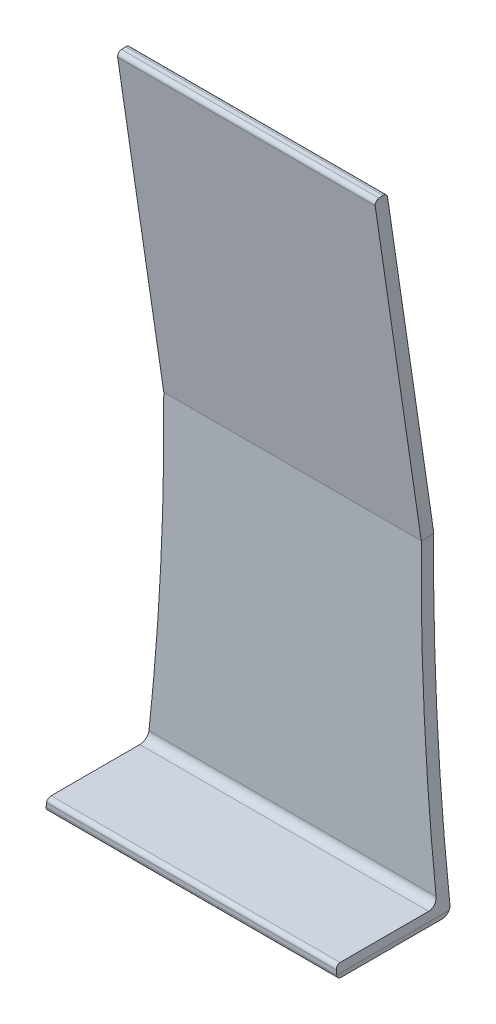
ISO-10303-21;
HEADER;
FILE_DESCRIPTION(('STEP AP214'),'2;1');
FILE_NAME('part.step','',(''),(''),'','','');
FILE_SCHEMA(('AUTOMOTIVE_DESIGN { 1 0 10303 214 1 1 1 1 }'));
ENDSEC;
DATA;
#1=APPLICATION_CONTEXT('core data for automotive mechanical design processes');
#2=APPLICATION_PROTOCOL_DEFINITION('international standard','automotive_design',2000,#1);
#3=PRODUCT_CONTEXT('',#1,'mechanical');
#4=PRODUCT('Part','Part','',(#3));
#5=PRODUCT_RELATED_PRODUCT_CATEGORY('part','',(#4));
#6=PRODUCT_DEFINITION_FORMATION('','',#4);
#7=PRODUCT_DEFINITION_CONTEXT('part definition',#1,'design');
#8=PRODUCT_DEFINITION('design','',#6,#7);
#9=PRODUCT_DEFINITION_SHAPE('','',#8);
#10=(LENGTH_UNIT() NAMED_UNIT(*) SI_UNIT(.MILLI.,.METRE.));
#11=(NAMED_UNIT(*) PLANE_ANGLE_UNIT() SI_UNIT($,.RADIAN.));
#12=(NAMED_UNIT(*) SI_UNIT($,.STERADIAN.) SOLID_ANGLE_UNIT());
#13=UNCERTAINTY_MEASURE_WITH_UNIT(LENGTH_MEASURE(1.E-05),#10,'distance_accuracy_value','');
#14=(GEOMETRIC_REPRESENTATION_CONTEXT(3) GLOBAL_UNCERTAINTY_ASSIGNED_CONTEXT((#13)) GLOBAL_UNIT_ASSIGNED_CONTEXT((#10,
#11,#12)) REPRESENTATION_CONTEXT('',''));
#15=CARTESIAN_POINT('',(0.,0.,0.));
#16=DIRECTION('',(0.,0.,1.));
#17=DIRECTION('',(1.,0.,0.));
#18=AXIS2_PLACEMENT_3D('',#15,#16,#17);
#19=CARTESIAN_POINT('',(70.,1.,-1.));
#20=DIRECTION('',(-1.,0.,0.));
#21=DIRECTION('',(0.,0.,1.));
#22=AXIS2_PLACEMENT_3D('',#19,#20,#21);
#23=CYLINDRICAL_SURFACE('',#22,1.);
#24=CARTESIAN_POINT('',(0.,1.,-1.));
#25=DIRECTION('',(1.,0.,0.));
#26=DIRECTION('',(0.,0.,1.));
#27=AXIS2_PLACEMENT_3D('',#24,#25,#26);
#28=CIRCLE('',#27,1.);
#29=CARTESIAN_POINT('',(0.,1.00000000000001,0.));
#30=VERTEX_POINT('',#29);
#31=CARTESIAN_POINT('',(0.,0.,-1.00000000000001));
#32=VERTEX_POINT('',#31);
#33=EDGE_CURVE('E175',#30,#32,#28,.T.);
#34=ORIENTED_EDGE('',*,*,#33,.T.);
#35=DIRECTION('',(-1.,0.,0.));
#36=VECTOR('',#35,1.);
#37=CARTESIAN_POINT('',(70.,0.,-1.00000000000001));
#38=LINE('',#37,#36);
#39=CARTESIAN_POINT('',(70.,0.,-1.00000000000001));
#40=VERTEX_POINT('',#39);
#41=EDGE_CURVE('E158',#40,#32,#38,.T.);
#42=ORIENTED_EDGE('',*,*,#41,.F.);
#43=CARTESIAN_POINT('',(70.,1.,-1.));
#44=DIRECTION('',(1.,0.,0.));
#45=DIRECTION('',(0.,0.,1.));
#46=AXIS2_PLACEMENT_3D('',#43,#44,#45);
#47=CIRCLE('',#46,1.);
#48=CARTESIAN_POINT('',(70.,1.00000000000001,0.));
#49=VERTEX_POINT('',#48);
#50=EDGE_CURVE('E176',#49,#40,#47,.T.);
#51=ORIENTED_EDGE('',*,*,#50,.F.);
#52=DIRECTION('',(-1.,0.,0.));
#53=VECTOR('',#52,1.);
#54=CARTESIAN_POINT('',(70.,1.00000000000001,0.));
#55=LINE('',#54,#53);
#56=EDGE_CURVE('E165',#49,#30,#55,.T.);
#57=ORIENTED_EDGE('',*,*,#56,.T.);
#58=EDGE_LOOP('',(#34,#42,#51,#57));
#59=FACE_BOUND('',#58,.T.);
#60=ADVANCED_FACE('F32',(#59),#23,.T.);
#61=CARTESIAN_POINT('',(70.,0.,-1.00000000000001));
#62=DIRECTION('',(0.,1.,0.));
#63=DIRECTION('',(0.,0.,1.));
#64=AXIS2_PLACEMENT_3D('',#61,#62,#63);
#65=PLANE('',#64);
#66=DIRECTION('',(0.,0.,-1.));
#67=VECTOR('',#66,1.);
#68=CARTESIAN_POINT('',(0.,0.,-1.00000000000001));
#69=LINE('',#68,#67);
#70=CARTESIAN_POINT('',(0.,0.,-25.3341841889218));
#71=VERTEX_POINT('',#70);
#72=EDGE_CURVE('E70',#32,#71,#69,.T.);
#73=ORIENTED_EDGE('',*,*,#72,.T.);
#74=DIRECTION('',(-1.,0.,0.));
#75=VECTOR('',#74,1.);
#76=CARTESIAN_POINT('',(70.,0.,-25.3341841889218));
#77=LINE('',#76,#75);
#78=CARTESIAN_POINT('',(70.,0.,-25.3341841889218));
#79=VERTEX_POINT('',#78);
#80=EDGE_CURVE('E222',#79,#71,#77,.T.);
#81=ORIENTED_EDGE('',*,*,#80,.F.);
#82=DIRECTION('',(0.,0.,-1.));
#83=VECTOR('',#82,1.);
#84=CARTESIAN_POINT('',(70.,0.,-1.00000000000001));
#85=LINE('',#84,#83);
#86=EDGE_CURVE('E73',#40,#79,#85,.T.);
#87=ORIENTED_EDGE('',*,*,#86,.F.);
#88=ORIENTED_EDGE('',*,*,#41,.T.);
#89=EDGE_LOOP('',(#73,#81,#87,#88));
#90=FACE_BOUND('',#89,.T.);
#91=ADVANCED_FACE('F408',(#90),#65,.F.);
#92=CARTESIAN_POINT('',(70.,2.,-25.3341841889218));
#93=DIRECTION('',(-1.,0.,0.));
#94=DIRECTION('',(0.,0.,1.));
#95=AXIS2_PLACEMENT_3D('',#92,#93,#94);
#96=CYLINDRICAL_SURFACE('',#95,2.);
#97=CARTESIAN_POINT('',(0.,2.,-25.3341841889218));
#98=DIRECTION('',(1.,0.,0.));
#99=DIRECTION('',(0.,0.,-1.));
#100=AXIS2_PLACEMENT_3D('',#97,#98,#99);
#101=CIRCLE('',#100,2.);
#102=CARTESIAN_POINT('',(0.,1.00000000000001,-27.0662349964907));
#103=VERTEX_POINT('',#102);
#104=EDGE_CURVE('E182',#71,#103,#101,.T.);
#105=ORIENTED_EDGE('',*,*,#104,.T.);
#106=CARTESIAN_POINT('',(0.,1.00000000000001,-27.0662349964907));
#107=CARTESIAN_POINT('',(0.00566837473459969,1.04952761063221,-27.094836947414));
#108=CARTESIAN_POINT('',(0.0114703006642798,1.10027558871766,-27.1212966130145));
#109=CARTESIAN_POINT('',(0.0232975177489211,1.20384214234055,-27.1697756343866));
#110=CARTESIAN_POINT('',(0.0293228692363169,1.25666127738482,-27.1917937803082));
#111=CARTESIAN_POINT('',(0.0414193265873751,1.36282520702131,-27.2307967349187));
#112=CARTESIAN_POINT('',(0.0474866984353297,1.41613460472333,-27.247879112971));
#113=CARTESIAN_POINT('',(0.0597444395328533,1.52396073862463,-27.2775091143252));
#114=CARTESIAN_POINT('',(0.0659347580603645,1.57847697795917,-27.2900585683226));
#115=CARTESIAN_POINT('',(0.0789765492342581,1.69346986071201,-27.3114974608418));
#116=CARTESIAN_POINT('',(0.0858360088400424,1.75402964913532,-27.3199384634157));
#117=CARTESIAN_POINT('',(0.0996770976981532,1.87638883643062,-27.33131960102));
#118=CARTESIAN_POINT('',(0.106659207942467,1.93819440360005,-27.3341928791318));
#119=CARTESIAN_POINT('',(0.113631751331707,2.,-27.3341841889218));
#120=B_SPLINE_CURVE_WITH_KNOTS('',3,(#106,#107,#108,#109,#110,#111,#112,#113,#114,#115,#116,
#117,#118,#119),.UNSPECIFIED.,.F.,.F.,(4,2,2,2,2,2,4),(0.,0.172366108157323,0.344779104860919,
0.51350501819713,0.682162712421396,0.866491903333709,1.0530211178474),.UNSPECIFIED.);
#121=CARTESIAN_POINT('',(0.113631751331587,1.99999999999894,-27.3341841889218));
#122=VERTEX_POINT('',#121);
#123=EDGE_CURVE('E46',#103,#122,#120,.T.);
#124=ORIENTED_EDGE('',*,*,#123,.T.);
#125=DIRECTION('',(-1.,0.,0.));
#126=VECTOR('',#125,1.);
#127=CARTESIAN_POINT('',(70.,2.,-27.3341841889218));
#128=LINE('',#127,#126);
#129=CARTESIAN_POINT('',(69.8863682486684,1.99999999999894,-27.3341841889218));
#130=VERTEX_POINT('',#129);
#131=EDGE_CURVE('E219',#130,#122,#128,.T.);
#132=ORIENTED_EDGE('',*,*,#131,.F.);
#133=CARTESIAN_POINT('',(69.8863682486683,2.,-27.3341841889218));
#134=CARTESIAN_POINT('',(69.8928112111658,1.94288887818373,-27.334190307768));
#135=CARTESIAN_POINT('',(69.8992621729982,1.88577903367717,-27.3317381658439));
#136=CARTESIAN_POINT('',(69.9121349316526,1.77195702566754,-27.3219602348797));
#137=CARTESIAN_POINT('',(69.9185567190648,1.71524498765147,-27.3146329722074));
#138=CARTESIAN_POINT('',(69.9311853584759,1.60385410633393,-27.2953563138686));
#139=CARTESIAN_POINT('',(69.9373938685675,1.5491577284811,-27.283509237101));
#140=CARTESIAN_POINT('',(69.9496894095101,1.44096025713908,-27.2552775053766));
#141=CARTESIAN_POINT('',(69.9557764895245,1.38745867881997,-27.2388947284648));
#142=CARTESIAN_POINT('',(69.9683466329068,1.27709892345756,-27.19996699828));
#143=CARTESIAN_POINT('',(69.9748139685758,1.22039048477345,-27.1769910514257));
#144=CARTESIAN_POINT('',(69.9875750933162,1.10862553826579,-27.1256328630637));
#145=CARTESIAN_POINT('',(69.9938658865407,1.05359685458001,-27.0971893208492));
#146=CARTESIAN_POINT('',(70.,1.00000000000001,-27.0662349964907));
#147=B_SPLINE_CURVE_WITH_KNOTS('',3,(#133,#134,#135,#136,#137,#138,#139,#140,#141,#142,#143,
#144,#145,#146),.UNSPECIFIED.,.F.,.F.,(4,2,2,2,2,2,4),(0.,0.172367690504828,0.344787507316629,
0.513515805321455,0.682174344160029,0.866496798530287,1.05302101478268),.UNSPECIFIED.);
#148=CARTESIAN_POINT('',(70.,1.00000000000001,-27.0662349964907));
#149=VERTEX_POINT('',#148);
#150=EDGE_CURVE('E264',#130,#149,#147,.T.);
#151=ORIENTED_EDGE('',*,*,#150,.T.);
#152=CARTESIAN_POINT('',(70.,2.,-25.3341841889218));
#153=DIRECTION('',(1.,0.,0.));
#154=DIRECTION('',(0.,0.,-1.));
#155=AXIS2_PLACEMENT_3D('',#152,#153,#154);
#156=CIRCLE('',#155,2.);
#157=EDGE_CURVE('E177',#79,#149,#156,.T.);
#158=ORIENTED_EDGE('',*,*,#157,.F.);
#159=ORIENTED_EDGE('',*,*,#80,.T.);
#160=EDGE_LOOP('',(#105,#124,#132,#151,#158,#159));
#161=FACE_BOUND('',#160,.T.);
#162=ADVANCED_FACE('F262',(#161),#96,.T.);
#163=CARTESIAN_POINT('',(70.,2.00000000000001,-27.3341841889218));
#164=DIRECTION('',(0.,0.,1.));
#165=DIRECTION('',(1.,0.,0.));
#166=AXIS2_PLACEMENT_3D('',#163,#164,#165);
#167=PLANE('',#166);
#168=ORIENTED_EDGE('',*,*,#131,.T.);
#169=CARTESIAN_POINT('',(0.,1.00000000000001,-27.3341841889218));
#170=CARTESIAN_POINT('',(4.36111830437642,39.1058037315147,-27.3341841889218));
#171=CARTESIAN_POINT('',(4.00000000000001,77.3575311069458,-27.3341841889218));
#172=B_SPLINE_CURVE_WITH_KNOTS('',2,(#169,#170,#171),.UNSPECIFIED.,.F.,.F.,(3,3),(0.,1.),.UNSPECIFIED.);
#173=CARTESIAN_POINT('',(4.00000000000002,77.3575311069458,-27.3341841889218));
#174=VERTEX_POINT('',#173);
#175=EDGE_CURVE('E375',#122,#174,#172,.T.);
#176=ORIENTED_EDGE('',*,*,#175,.T.);
#177=DIRECTION('',(0.,1.,0.));
#178=VECTOR('',#177,1.);
#179=CARTESIAN_POINT('',(4.00000000000003,2.,-27.3341841889218));
#180=LINE('',#179,#178);
#181=CARTESIAN_POINT('',(4.00000000000002,77.577100538008,-27.3341841889218));
#182=VERTEX_POINT('',#181);
#183=EDGE_CURVE('E180',#174,#182,#180,.T.);
#184=ORIENTED_EDGE('',*,*,#183,.T.);
#185=DIRECTION('',(-1.,0.,0.));
#186=VECTOR('',#185,1.);
#187=CARTESIAN_POINT('',(70.,77.577100538008,-27.3341841889218));
#188=LINE('',#187,#186);
#189=CARTESIAN_POINT('',(66.,77.577100538008,-27.3341841889218));
#190=VERTEX_POINT('',#189);
#191=EDGE_CURVE('E216',#190,#182,#188,.T.);
#192=ORIENTED_EDGE('',*,*,#191,.F.);
#193=DIRECTION('',(0.,-1.,0.));
#194=VECTOR('',#193,1.);
#195=CARTESIAN_POINT('',(66.,2.00000000000002,-27.3341841889218));
#196=LINE('',#195,#194);
#197=CARTESIAN_POINT('',(66.,77.3575311069458,-27.3341841889218));
#198=VERTEX_POINT('',#197);
#199=EDGE_CURVE('E243',#190,#198,#196,.T.);
#200=ORIENTED_EDGE('',*,*,#199,.T.);
#201=CARTESIAN_POINT('',(66.,77.3575311069458,-27.3341841889218));
#202=CARTESIAN_POINT('',(65.6388816956236,39.1058037315147,-27.3341841889218));
#203=CARTESIAN_POINT('',(70.,1.00000000000001,-27.3341841889218));
#204=B_SPLINE_CURVE_WITH_KNOTS('',2,(#201,#202,#203),.UNSPECIFIED.,.F.,.F.,(3,3),(0.,1.),.UNSPECIFIED.);
#205=EDGE_CURVE('E266',#198,#130,#204,.T.);
#206=ORIENTED_EDGE('',*,*,#205,.T.);
#207=EDGE_LOOP('',(#168,#176,#184,#192,#200,#206));
#208=FACE_BOUND('',#207,.T.);
#209=ADVANCED_FACE('F386',(#208),#167,.F.);
#210=CARTESIAN_POINT('',(70.,77.577100538008,-27.3341841889218));
#211=DIRECTION('',(0.,-0.145599679864729,0.98934358704309));
#212=DIRECTION('',(0.,-0.98934358704309,-0.145599679864729));
#213=AXIS2_PLACEMENT_3D('',#210,#211,#212);
#214=PLANE('',#213);
#215=ORIENTED_EDGE('',*,*,#191,.T.);
#216=DIRECTION('',(0.,0.98934358704309,0.145599679864729));
#217=VECTOR('',#216,1.);
#218=CARTESIAN_POINT('',(4.00000000000002,77.5771005380079,-27.3341841889218));
#219=LINE('',#218,#217);
#220=CARTESIAN_POINT('',(4.,153.114908846969,-16.2174388524111));
#221=VERTEX_POINT('',#220);
#222=EDGE_CURVE('E185',#182,#221,#219,.T.);
#223=ORIENTED_EDGE('',*,*,#222,.T.);
#224=DIRECTION('',(-1.,0.,0.));
#225=VECTOR('',#224,1.);
#226=CARTESIAN_POINT('',(70.,153.114908846969,-16.2174388524112));
#227=LINE('',#226,#225);
#228=CARTESIAN_POINT('',(66.,153.114908846969,-16.2174388524111));
#229=VERTEX_POINT('',#228);
#230=EDGE_CURVE('E213',#229,#221,#227,.T.);
#231=ORIENTED_EDGE('',*,*,#230,.F.);
#232=DIRECTION('',(0.,-0.98934358704309,-0.145599679864729));
#233=VECTOR('',#232,1.);
#234=CARTESIAN_POINT('',(66.,77.577100538008,-27.3341841889218));
#235=LINE('',#234,#233);
#236=EDGE_CURVE('E248',#229,#190,#235,.T.);
#237=ORIENTED_EDGE('',*,*,#236,.T.);
#238=EDGE_LOOP('',(#215,#223,#231,#237));
#239=FACE_BOUND('',#238,.T.);
#240=ADVANCED_FACE('F393',(#239),#214,.F.);
#241=CARTESIAN_POINT('',(70.,152.969309167104,-15.2280952653679));
#242=DIRECTION('',(-1.,0.,0.));
#243=DIRECTION('',(0.,0.,1.));
#244=AXIS2_PLACEMENT_3D('',#241,#242,#243);
#245=CYLINDRICAL_SURFACE('',#244,1.00000000000008);
#246=ORIENTED_EDGE('',*,*,#230,.T.);
#247=CARTESIAN_POINT('',(4.,152.969309167104,-15.2280952653679));
#248=DIRECTION('',(1.,0.,0.));
#249=DIRECTION('',(0.,1.,0.));
#250=AXIS2_PLACEMENT_3D('',#247,#248,#249);
#251=CIRCLE('',#250,1.00000000000008);
#252=CARTESIAN_POINT('',(4.,153.966641505656,-15.1551007006495));
#253=VERTEX_POINT('',#252);
#254=EDGE_CURVE('E245',#221,#253,#251,.T.);
#255=ORIENTED_EDGE('',*,*,#254,.T.);
#256=DIRECTION('',(-1.,0.,0.));
#257=VECTOR('',#256,1.);
#258=CARTESIAN_POINT('',(70.,153.966641505656,-15.1551007006495));
#259=LINE('',#258,#257);
#260=CARTESIAN_POINT('',(66.,153.966641505656,-15.1551007006495));
#261=VERTEX_POINT('',#260);
#262=EDGE_CURVE('E210',#261,#253,#259,.T.);
#263=ORIENTED_EDGE('',*,*,#262,.F.);
#264=CARTESIAN_POINT('',(66.,152.969309167104,-15.2280952653679));
#265=DIRECTION('',(-1.,0.,0.));
#266=DIRECTION('',(0.,-1.,0.));
#267=AXIS2_PLACEMENT_3D('',#264,#265,#266);
#268=CIRCLE('',#267,1.00000000000008);
#269=EDGE_CURVE('E394',#261,#229,#268,.T.);
#270=ORIENTED_EDGE('',*,*,#269,.T.);
#271=EDGE_LOOP('',(#246,#255,#263,#270));
#272=FACE_BOUND('',#271,.T.);
#273=ADVANCED_FACE('F421',(#272),#245,.T.);
#274=CARTESIAN_POINT('',(70.,153.893451695302,-14.1551007006495));
#275=DIRECTION('',(0.,-0.997332338551971,-0.0729945647185929));
#276=DIRECTION('',(0.,0.0729945647185929,-0.997332338551971));
#277=AXIS2_PLACEMENT_3D('',#274,#275,#276);
#278=PLANE('',#277);
#279=ORIENTED_EDGE('',*,*,#262,.T.);
#280=DIRECTION('',(0.,-0.0729945647185929,0.997332338551971));
#281=VECTOR('',#280,1.);
#282=CARTESIAN_POINT('',(4.,153.893451695302,-14.1551007006495));
#283=LINE('',#282,#281);
#284=CARTESIAN_POINT('',(4.,153.893451695302,-14.1551007006495));
#285=VERTEX_POINT('',#284);
#286=EDGE_CURVE('E242',#253,#285,#283,.T.);
#287=ORIENTED_EDGE('',*,*,#286,.T.);
#288=DIRECTION('',(-1.,0.,0.));
#289=VECTOR('',#288,1.);
#290=CARTESIAN_POINT('',(70.,153.893451695302,-14.1551007006495));
#291=LINE('',#290,#289);
#292=CARTESIAN_POINT('',(66.,153.893451695302,-14.1551007006495));
#293=VERTEX_POINT('',#292);
#294=EDGE_CURVE('E207',#293,#285,#291,.T.);
#295=ORIENTED_EDGE('',*,*,#294,.F.);
#296=DIRECTION('',(0.,0.0729945647185929,-0.997332338551971));
#297=VECTOR('',#296,1.);
#298=CARTESIAN_POINT('',(66.,153.893451695302,-14.1551007006495));
#299=LINE('',#298,#297);
#300=EDGE_CURVE('E268',#293,#261,#299,.T.);
#301=ORIENTED_EDGE('',*,*,#300,.T.);
#302=EDGE_LOOP('',(#279,#287,#295,#301));
#303=FACE_BOUND('',#302,.T.);
#304=ADVANCED_FACE('F426',(#303),#278,.F.);
#305=CARTESIAN_POINT('',(70.,152.89611935675,-14.2280952653679));
#306=DIRECTION('',(-1.,0.,0.));
#307=DIRECTION('',(0.,0.,1.));
#308=AXIS2_PLACEMENT_3D('',#305,#306,#307);
#309=CYLINDRICAL_SURFACE('',#308,0.999999999999915);
#310=ORIENTED_EDGE('',*,*,#294,.T.);
#311=CARTESIAN_POINT('',(4.,152.89611935675,-14.2280952653679));
#312=DIRECTION('',(1.,0.,0.));
#313=DIRECTION('',(0.,1.,0.));
#314=AXIS2_PLACEMENT_3D('',#311,#312,#313);
#315=CIRCLE('',#314,0.999999999999915);
#316=CARTESIAN_POINT('',(4.,152.750519676885,-13.238751678325));
#317=VERTEX_POINT('',#316);
#318=EDGE_CURVE('E239',#285,#317,#315,.T.);
#319=ORIENTED_EDGE('',*,*,#318,.T.);
#320=DIRECTION('',(-1.,0.,0.));
#321=VECTOR('',#320,1.);
#322=CARTESIAN_POINT('',(70.,152.750519676885,-13.2387516783249));
#323=LINE('',#322,#321);
#324=CARTESIAN_POINT('',(66.,152.750519676885,-13.238751678325));
#325=VERTEX_POINT('',#324);
#326=EDGE_CURVE('E204',#325,#317,#323,.T.);
#327=ORIENTED_EDGE('',*,*,#326,.F.);
#328=CARTESIAN_POINT('',(66.,152.89611935675,-14.2280952653679));
#329=DIRECTION('',(-1.,0.,0.));
#330=DIRECTION('',(0.,-1.,0.));
#331=AXIS2_PLACEMENT_3D('',#328,#329,#330);
#332=CIRCLE('',#331,0.999999999999915);
#333=EDGE_CURVE('E237',#325,#293,#332,.T.);
#334=ORIENTED_EDGE('',*,*,#333,.T.);
#335=EDGE_LOOP('',(#310,#319,#327,#334));
#336=FACE_BOUND('',#335,.T.);
#337=ADVANCED_FACE('F236',(#336),#309,.T.);
#338=CARTESIAN_POINT('',(70.,77.3575311069458,-24.3341841889218));
#339=DIRECTION('',(0.,0.145599679864729,-0.98934358704309));
#340=DIRECTION('',(0.,0.98934358704309,0.145599679864729));
#341=AXIS2_PLACEMENT_3D('',#338,#339,#340);
#342=PLANE('',#341);
#343=ORIENTED_EDGE('',*,*,#326,.T.);
#344=DIRECTION('',(0.,-0.98934358704309,-0.145599679864729));
#345=VECTOR('',#344,1.);
#346=CARTESIAN_POINT('',(4.00000000000002,77.3575311069458,-24.3341841889218));
#347=LINE('',#346,#345);
#348=CARTESIAN_POINT('',(4.00000000000002,77.3575311069458,-24.3341841889218));
#349=VERTEX_POINT('',#348);
#350=EDGE_CURVE('E11',#317,#349,#347,.T.);
#351=ORIENTED_EDGE('',*,*,#350,.T.);
#352=DIRECTION('',(-1.,0.,0.));
#353=VECTOR('',#352,1.);
#354=CARTESIAN_POINT('',(70.,77.3575311069458,-24.3341841889218));
#355=LINE('',#354,#353);
#356=CARTESIAN_POINT('',(66.,77.3575311069458,-24.3341841889218));
#357=VERTEX_POINT('',#356);
#358=EDGE_CURVE('E201',#357,#349,#355,.T.);
#359=ORIENTED_EDGE('',*,*,#358,.F.);
#360=DIRECTION('',(0.,0.98934358704309,0.145599679864729));
#361=VECTOR('',#360,1.);
#362=CARTESIAN_POINT('',(66.,77.3575311069458,-24.3341841889218));
#363=LINE('',#362,#361);
#364=EDGE_CURVE('E39',#357,#325,#363,.T.);
#365=ORIENTED_EDGE('',*,*,#364,.T.);
#366=EDGE_LOOP('',(#343,#351,#359,#365));
#367=FACE_BOUND('',#366,.T.);
#368=ADVANCED_FACE('F229',(#367),#342,.F.);
#369=CARTESIAN_POINT('',(70.,5.00000000000002,-24.3341841889218));
#370=DIRECTION('',(0.,0.,-1.));
#371=DIRECTION('',(-1.,0.,0.));
#372=AXIS2_PLACEMENT_3D('',#369,#370,#371);
#373=PLANE('',#372);
#374=ORIENTED_EDGE('',*,*,#358,.T.);
#375=CARTESIAN_POINT('',(0.,1.00000000000001,-24.3341841889218));
#376=CARTESIAN_POINT('',(4.36111830437642,39.1058037315147,-24.3341841889218));
#377=CARTESIAN_POINT('',(4.00000000000001,77.3575311069458,-24.3341841889218));
#378=B_SPLINE_CURVE_WITH_KNOTS('',2,(#375,#376,#377),.UNSPECIFIED.,.F.,.F.,(3,3),(0.,1.),.UNSPECIFIED.);
#379=CARTESIAN_POINT('',(0.444738624402719,5.00000000000002,-24.3341841889218));
#380=VERTEX_POINT('',#379);
#381=EDGE_CURVE('E371',#349,#380,#378,.F.);
#382=ORIENTED_EDGE('',*,*,#381,.T.);
#383=DIRECTION('',(-1.,0.,0.));
#384=VECTOR('',#383,1.);
#385=CARTESIAN_POINT('',(70.,5.00000000000002,-24.3341841889218));
#386=LINE('',#385,#384);
#387=CARTESIAN_POINT('',(69.5552613755973,5.00000000000002,-24.3341841889218));
#388=VERTEX_POINT('',#387);
#389=EDGE_CURVE('E198',#388,#380,#386,.T.);
#390=ORIENTED_EDGE('',*,*,#389,.F.);
#391=CARTESIAN_POINT('',(66.,77.3575311069458,-24.3341841889218));
#392=CARTESIAN_POINT('',(65.6388816956236,39.1058037315147,-24.3341841889218));
#393=CARTESIAN_POINT('',(70.,1.00000000000001,-24.3341841889218));
#394=B_SPLINE_CURVE_WITH_KNOTS('',2,(#391,#392,#393),.UNSPECIFIED.,.F.,.F.,(3,3),(0.,1.),.UNSPECIFIED.);
#395=EDGE_CURVE('E270',#388,#357,#394,.F.);
#396=ORIENTED_EDGE('',*,*,#395,.T.);
#397=EDGE_LOOP('',(#374,#382,#390,#396));
#398=FACE_BOUND('',#397,.T.);
#399=ADVANCED_FACE('F360',(#398),#373,.F.);
#400=CARTESIAN_POINT('',(70.,5.,-22.3341841889218));
#401=DIRECTION('',(-1.,0.,0.));
#402=DIRECTION('',(0.,0.,1.));
#403=AXIS2_PLACEMENT_3D('',#400,#401,#402);
#404=CYLINDRICAL_SURFACE('',#403,2.);
#405=ORIENTED_EDGE('',*,*,#389,.T.);
#406=CARTESIAN_POINT('',(0.444738624402719,5.00000000000002,-24.3341841889218));
#407=CARTESIAN_POINT('',(0.438638819741632,4.94347928848522,-24.3341836367897));
#408=CARTESIAN_POINT('',(0.432534111464439,4.88698645114667,-24.3317867603169));
#409=CARTESIAN_POINT('',(0.420352967335988,4.77440507332534,-24.3222238869781));
#410=CARTESIAN_POINT('',(0.414276530423185,4.71831651761829,-24.3150580706575));
#411=CARTESIAN_POINT('',(0.396164052049836,4.55133961231448,-24.2864706468755));
#412=CARTESIAN_POINT('',(0.384226445076777,4.44156957623692,-24.2579589022437));
#413=CARTESIAN_POINT('',(0.360984196148855,4.22835096384902,-24.1827944841163));
#414=CARTESIAN_POINT('',(0.349679893317215,4.12490577172315,-24.1361321955642));
#415=CARTESIAN_POINT('',(0.328040893076846,3.9273086546371,-24.0259636134602));
#416=CARTESIAN_POINT('',(0.317705983009277,3.83315469119281,-23.9624610259732));
#417=CARTESIAN_POINT('',(0.298342752040652,3.65707577782116,-23.8205593330269));
#418=CARTESIAN_POINT('',(0.289311242359921,3.57512096656628,-23.7421977069549));
#419=CARTESIAN_POINT('',(0.272800668134099,3.42552552988326,-23.5726548593521));
#420=CARTESIAN_POINT('',(0.265321887891256,3.35788752579522,-23.4814712952625));
#421=CARTESIAN_POINT('',(0.252190726222473,3.23926550460471,-23.2894271798284));
#422=CARTESIAN_POINT('',(0.246528678248343,3.18819332692264,-23.1886216779822));
#423=CARTESIAN_POINT('',(0.237157884747516,3.10373078223807,-22.9798044360663));
#424=CARTESIAN_POINT('',(0.233447825173293,3.07032852004682,-22.8717975991486));
#425=CARTESIAN_POINT('',(0.229064464465134,3.03087759690237,-22.6915852796912));
#426=CARTESIAN_POINT('',(0.227778187069994,3.01930544762852,-22.6205554111591));
#427=CARTESIAN_POINT('',(0.226062005998094,3.00386800048978,-22.4777554873294));
#428=CARTESIAN_POINT('',(0.225630885167232,2.99999174895848,-22.4059866304067));
#429=CARTESIAN_POINT('',(0.225631941926784,3.,-22.3341841889217));
#430=B_SPLINE_CURVE_WITH_KNOTS('',3,(#406,#407,#408,#409,#410,#411,#412,#413,#414,#415,#416,
#417,#418,#419,#420,#421,#422,#423,#424,#425,#426,#427,#428,#429),.UNSPECIFIED.,.F.,.F.,(4,2,2,
2,2,2,2,2,2,2,2,4),(0.,0.17044218220207,0.340877912071965,0.68124158693233,1.02178581189968,
1.36225515499051,1.70187687857729,2.04156073161836,2.37940599586187,2.7170235361083,
2.93256657549954,3.14780260925613),.UNSPECIFIED.);
#431=CARTESIAN_POINT('',(0.225631941926784,3.,-22.3341841889218));
#432=VERTEX_POINT('',#431);
#433=EDGE_CURVE('E364',#380,#432,#430,.T.);
#434=ORIENTED_EDGE('',*,*,#433,.T.);
#435=DIRECTION('',(-1.,0.,0.));
#436=VECTOR('',#435,1.);
#437=CARTESIAN_POINT('',(70.,3.,-22.3341841889218));
#438=LINE('',#437,#436);
#439=CARTESIAN_POINT('',(69.7743680580732,3.00000000000001,-22.3341841889218));
#440=VERTEX_POINT('',#439);
#441=EDGE_CURVE('E195',#440,#432,#438,.T.);
#442=ORIENTED_EDGE('',*,*,#441,.F.);
#443=CARTESIAN_POINT('',(69.7743680580732,3.,-22.3341841889218));
#444=CARTESIAN_POINT('',(69.7743680811387,3.00000018890719,-22.3902055090556));
#445=CARTESIAN_POINT('',(69.7741061823416,3.0023552830444,-22.4461999009871));
#446=CARTESIAN_POINT('',(69.7730617843236,3.01174947727773,-22.5577860239832));
#447=CARTESIAN_POINT('',(69.772279316612,3.01878829387453,-22.6133777792129));
#448=CARTESIAN_POINT('',(69.7691596750491,3.04685787815067,-22.7788346866989));
#449=CARTESIAN_POINT('',(69.7660502358648,3.07484199922264,-22.8875883662519));
#450=CARTESIAN_POINT('',(69.757868661692,3.14854860151669,-23.0988169847173));
#451=CARTESIAN_POINT('',(69.7527957047819,3.19427851108428,-23.201289273426));
#452=CARTESIAN_POINT('',(69.7408467880765,3.3021407549784,-23.3970848149796));
#453=CARTESIAN_POINT('',(69.7339710548169,3.36427102845191,-23.4904092153197));
#454=CARTESIAN_POINT('',(69.7186078688679,3.50333354416799,-23.6655481554791));
#455=CARTESIAN_POINT('',(69.7101160569902,3.58030582863577,-23.7473304981356));
#456=CARTESIAN_POINT('',(69.69178951303,3.74675646308284,-23.896840965839));
#457=CARTESIAN_POINT('',(69.6819545026617,3.836237404714,-23.9645661711625));
#458=CARTESIAN_POINT('',(69.6611755585325,4.02571175317978,-24.0844440234433));
#459=CARTESIAN_POINT('',(69.6502253816857,4.12576447633203,-24.1365017287127));
#460=CARTESIAN_POINT('',(69.6275892579902,4.33309509330434,-24.2230569974712));
#461=CARTESIAN_POINT('',(69.615903686037,4.44036930761002,-24.2575634281907));
#462=CARTESIAN_POINT('',(69.5960023813662,4.62352668025901,-24.2998955609002));
#463=CARTESIAN_POINT('',(69.5878912499559,4.69829957964483,-24.3127456970052));
#464=CARTESIAN_POINT('',(69.5716035517083,4.8487045007873,-24.3298892402365));
#465=CARTESIAN_POINT('',(69.5634270933867,4.92433516099881,-24.3341946989586));
#466=CARTESIAN_POINT('',(69.5552613755973,5.00000000000002,-24.3341841889218));
#467=B_SPLINE_CURVE_WITH_KNOTS('',3,(#443,#444,#445,#446,#447,#448,#449,#450,#451,#452,#453,
#454,#455,#456,#457,#458,#459,#460,#461,#462,#463,#464,#465,#466),.UNSPECIFIED.,.F.,.F.,(4,2,2,
2,2,2,2,2,2,2,2,4),(0.,0.16796042398572,0.335910682481084,0.671198465757488,1.00662675137543,
1.34201290746489,1.67831689174055,2.01469065794438,2.35306353390231,2.69126528736068,
2.91971477734204,3.14784182763492),.UNSPECIFIED.);
#468=EDGE_CURVE('E348',#440,#388,#467,.T.);
#469=ORIENTED_EDGE('',*,*,#468,.T.);
#470=EDGE_LOOP('',(#405,#434,#442,#469));
#471=FACE_BOUND('',#470,.T.);
#472=ADVANCED_FACE('F356',(#471),#404,.F.);
#473=CARTESIAN_POINT('',(70.,3.,-1.00000000000001));
#474=DIRECTION('',(0.,-1.,0.));
#475=DIRECTION('',(0.,0.,-1.));
#476=AXIS2_PLACEMENT_3D('',#473,#474,#475);
#477=PLANE('',#476);
#478=ORIENTED_EDGE('',*,*,#441,.T.);
#479=DIRECTION('',(0.,0.,1.));
#480=VECTOR('',#479,1.);
#481=CARTESIAN_POINT('',(0.225631941926784,3.,-70.));
#482=LINE('',#481,#480);
#483=CARTESIAN_POINT('',(0.22563194192678,3.,-0.99999999999999));
#484=VERTEX_POINT('',#483);
#485=EDGE_CURVE('E320',#432,#484,#482,.T.);
#486=ORIENTED_EDGE('',*,*,#485,.T.);
#487=DIRECTION('',(-1.,0.,0.));
#488=VECTOR('',#487,1.);
#489=CARTESIAN_POINT('',(70.,3.,-1.00000000000001));
#490=LINE('',#489,#488);
#491=CARTESIAN_POINT('',(69.7743680580732,3.,-1.));
#492=VERTEX_POINT('',#491);
#493=EDGE_CURVE('E192',#492,#484,#490,.T.);
#494=ORIENTED_EDGE('',*,*,#493,.F.);
#495=DIRECTION('',(0.,0.,1.));
#496=VECTOR('',#495,1.);
#497=CARTESIAN_POINT('',(69.7743680580732,3.00000000000001,-70.));
#498=LINE('',#497,#496);
#499=EDGE_CURVE('E340',#492,#440,#498,.F.);
#500=ORIENTED_EDGE('',*,*,#499,.T.);
#501=EDGE_LOOP('',(#478,#486,#494,#500));
#502=FACE_BOUND('',#501,.T.);
#503=ADVANCED_FACE('F327',(#502),#477,.F.);
#504=CARTESIAN_POINT('',(70.,2.,-1.));
#505=DIRECTION('',(-1.,0.,0.));
#506=DIRECTION('',(0.,0.,1.));
#507=AXIS2_PLACEMENT_3D('',#504,#505,#506);
#508=CYLINDRICAL_SURFACE('',#507,1.);
#509=ORIENTED_EDGE('',*,*,#493,.T.);
#510=CARTESIAN_POINT('',(0.22563194192678,3.,-0.99999999999999));
#511=CARTESIAN_POINT('',(0.225631918907533,2.99999989214703,-0.971990969169908));
#512=CARTESIAN_POINT('',(0.225501022193844,2.99882248936704,-0.943995410429791));
#513=CARTESIAN_POINT('',(0.224978817143569,2.9941259495546,-0.888205543960975));
#514=CARTESIAN_POINT('',(0.224587524134921,2.99060695035761,-0.860411224483892));
#515=CARTESIAN_POINT('',(0.223026927093057,2.97657368173038,-0.777687112052076));
#516=CARTESIAN_POINT('',(0.221470893574049,2.962583032345,-0.723312941275039));
#517=CARTESIAN_POINT('',(0.217370488427473,2.92573399183521,-0.617703886969069));
#518=CARTESIAN_POINT('',(0.214825700627757,2.90287186666276,-0.566470335871347));
#519=CARTESIAN_POINT('',(0.208819077468614,2.84894616872488,-0.468577037541362));
#520=CARTESIAN_POINT('',(0.205357359059803,2.81788364188761,-0.421916708053125));
#521=CARTESIAN_POINT('',(0.197603479728695,2.74836597952469,-0.33435415724123));
#522=CARTESIAN_POINT('',(0.193309059294046,2.70989073166012,-0.293468138222085));
#523=CARTESIAN_POINT('',(0.184011669387755,2.62667458666411,-0.218716970879687));
#524=CARTESIAN_POINT('',(0.179008675506085,2.58193347367712,-0.184852064529585));
#525=CARTESIAN_POINT('',(0.171066765162201,2.51098769954764,-0.139950540909444));
#526=CARTESIAN_POINT('',(0.168335736629154,2.48660360037512,-0.125925573111327));
#527=CARTESIAN_POINT('',(0.162752126690293,2.43677781694712,-0.0999924788942413));
#528=CARTESIAN_POINT('',(0.159899656215329,2.41133709835676,-0.0880824699073924));
#529=CARTESIAN_POINT('',(0.15118537757686,2.33366095272729,-0.0556426816869108));
#530=CARTESIAN_POINT('',(0.145161694582137,2.28002678978908,-0.038374889254407));
#531=CARTESIAN_POINT('',(0.134861260768626,2.18842510871832,-0.0171773244894338));
#532=CARTESIAN_POINT('',(0.130649641819635,2.15100123778384,-0.0107399445288242));
#533=CARTESIAN_POINT('',(0.122171271431193,2.07572541395696,-0.00215285464815123));
#534=CARTESIAN_POINT('',(0.11790460670214,2.03787414384456,2.92632538295872E-06));
#535=CARTESIAN_POINT('',(0.113631751331706,1.99999999999999,0.));
#536=B_SPLINE_CURVE_WITH_KNOTS('',3,(#510,#511,#512,#513,#514,#515,#516,#517,#518,#519,#520,
#521,#522,#523,#524,#525,#526,#527,#528,#529,#530,#531,#532,#533,#534,#535),.UNSPECIFIED.,.F.,
.F.,(4,2,2,2,2,2,2,2,2,2,2,2,4),(0.,0.0839753117647078,0.167945680853272,0.335580699822451,
0.503286353868282,0.670970628059667,0.839116442097409,1.00726805009026,1.09196696138744,
1.17659009837044,1.34567885782349,1.46007743472457,1.57431368508945),.UNSPECIFIED.);
#537=CARTESIAN_POINT('',(0.113631751330698,1.99999999999105,0.));
#538=VERTEX_POINT('',#537);
#539=EDGE_CURVE('E313',#484,#538,#536,.T.);
#540=ORIENTED_EDGE('',*,*,#539,.T.);
#541=DIRECTION('',(-1.,0.,0.));
#542=VECTOR('',#541,1.);
#543=CARTESIAN_POINT('',(70.,1.99999999999999,0.));
#544=LINE('',#543,#542);
#545=CARTESIAN_POINT('',(69.8863682486693,1.99999999999106,0.));
#546=VERTEX_POINT('',#545);
#547=EDGE_CURVE('E168',#546,#538,#544,.T.);
#548=ORIENTED_EDGE('',*,*,#547,.F.);
#549=CARTESIAN_POINT('',(69.8863682486683,1.99999999999999,0.));
#550=CARTESIAN_POINT('',(69.8799916924176,2.05651917485773,4.12876996248797E-05));
#551=CARTESIAN_POINT('',(69.8736260841669,2.11301574199906,-0.00479026599364245));
#552=CARTESIAN_POINT('',(69.8610928476593,2.22438340500901,-0.0238746934188964));
#553=CARTESIAN_POINT('',(69.8549251032616,2.27925545291225,-0.0381219302260222));
#554=CARTESIAN_POINT('',(69.84295236918,2.38589425017047,-0.0757243445262717));
#555=CARTESIAN_POINT('',(69.8371475794914,2.43765928688096,-0.0990844929863793));
#556=CARTESIAN_POINT('',(69.8288467417432,2.51175975273308,-0.140404649690915));
#557=CARTESIAN_POINT('',(69.826147298079,2.53587071490866,-0.155226289975227));
#558=CARTESIAN_POINT('',(69.8208972790801,2.58278634917012,-0.186881562246036));
#559=CARTESIAN_POINT('',(69.818346852314,2.60558971718737,-0.203717152845735));
#560=CARTESIAN_POINT('',(69.8109685978138,2.6715896439656,-0.256932866197259));
#561=CARTESIAN_POINT('',(69.806390374639,2.71258517610418,-0.296138829868331));
#562=CARTESIAN_POINT('',(69.7980422448277,2.78739422411538,-0.380962156998109));
#563=CARTESIAN_POINT('',(69.7942722827278,2.82120823278533,-0.426579080178511));
#564=CARTESIAN_POINT('',(69.7893135706265,2.86570986103145,-0.498660567515551));
#565=CARTESIAN_POINT('',(69.7877792528496,2.8794842674668,-0.523240534722789));
#566=CARTESIAN_POINT('',(69.7849482500357,2.90490627789968,-0.573459746928861));
#567=CARTESIAN_POINT('',(69.783651356037,2.91655575206239,-0.599098035879519));
#568=CARTESIAN_POINT('',(69.780130633999,2.94818742513767,-0.677359044396685));
#569=CARTESIAN_POINT('',(69.7782730041611,2.96488665039206,-0.731382693719971));
#570=CARTESIAN_POINT('',(69.77608139397,2.98459147216938,-0.821465471218034));
#571=CARTESIAN_POINT('',(69.7754392695404,2.99036595647691,-0.85694659804763));
#572=CARTESIAN_POINT('',(69.7745828149493,2.9980684573038,-0.928277738586754));
#573=CARTESIAN_POINT('',(69.7743678753252,3.0000019537401,-0.96412715330388));
#574=CARTESIAN_POINT('',(69.7743680580732,2.99999999999999,-1.));
#575=B_SPLINE_CURVE_WITH_KNOTS('',3,(#549,#550,#551,#552,#553,#554,#555,#556,#557,#558,#559,
#560,#561,#562,#563,#564,#565,#566,#567,#568,#569,#570,#571,#572,#573,#574),.UNSPECIFIED.,.F.,
.F.,(4,2,2,2,2,2,2,2,2,2,2,2,4),(0.,0.170388009332079,0.340674104083398,0.511053217718927,
0.596257945786977,0.681546221584215,0.85140990356119,1.02126192569519,1.10582634828661,
1.19031598230612,1.35910423811018,1.46677771672401,1.57429746751816),.UNSPECIFIED.);
#576=EDGE_CURVE('E332',#546,#492,#575,.T.);
#577=ORIENTED_EDGE('',*,*,#576,.T.);
#578=EDGE_LOOP('',(#509,#540,#548,#577));
#579=FACE_BOUND('',#578,.T.);
#580=ADVANCED_FACE('F322',(#579),#508,.T.);
#581=CARTESIAN_POINT('',(70.,1.00000000000001,0.));
#582=DIRECTION('',(0.,0.,-1.));
#583=DIRECTION('',(-1.,0.,0.));
#584=AXIS2_PLACEMENT_3D('',#581,#582,#583);
#585=PLANE('',#584);
#586=ORIENTED_EDGE('',*,*,#547,.T.);
#587=CARTESIAN_POINT('',(0.,1.00000000000001,0.));
#588=CARTESIAN_POINT('',(4.36111830437642,39.1058037315147,0.));
#589=CARTESIAN_POINT('',(4.00000000000001,77.3575311069458,0.));
#590=B_SPLINE_CURVE_WITH_KNOTS('',2,(#587,#588,#589),.UNSPECIFIED.,.F.,.F.,(3,3),(0.,1.),.UNSPECIFIED.);
#591=EDGE_CURVE('E151',#30,#538,#590,.T.);
#592=ORIENTED_EDGE('',*,*,#591,.F.);
#593=ORIENTED_EDGE('',*,*,#56,.F.);
#594=CARTESIAN_POINT('',(66.,77.3575311069458,0.));
#595=CARTESIAN_POINT('',(65.6388816956236,39.1058037315147,0.));
#596=CARTESIAN_POINT('',(70.,1.00000000000001,0.));
#597=B_SPLINE_CURVE_WITH_KNOTS('',2,(#594,#595,#596),.UNSPECIFIED.,.F.,.F.,(3,3),(0.,1.),.UNSPECIFIED.);
#598=EDGE_CURVE('E55',#546,#49,#597,.T.);
#599=ORIENTED_EDGE('',*,*,#598,.F.);
#600=EDGE_LOOP('',(#586,#592,#593,#599));
#601=FACE_BOUND('',#600,.T.);
#602=ADVANCED_FACE('F164',(#601),#585,.F.);
#603=CARTESIAN_POINT('',(70.,1.,-1.));
#604=DIRECTION('',(-1.,0.,0.));
#605=DIRECTION('',(0.,0.,1.));
#606=AXIS2_PLACEMENT_3D('',#603,#604,#605);
#607=PLANE('',#606);
#608=ORIENTED_EDGE('',*,*,#157,.T.);
#609=DIRECTION('',(0.,0.,1.));
#610=VECTOR('',#609,1.);
#611=CARTESIAN_POINT('',(70.,1.00000000000001,-70.));
#612=LINE('',#611,#610);
#613=EDGE_CURVE('E157',#149,#49,#612,.T.);
#614=ORIENTED_EDGE('',*,*,#613,.T.);
#615=ORIENTED_EDGE('',*,*,#50,.T.);
#616=ORIENTED_EDGE('',*,*,#86,.T.);
#617=EDGE_LOOP('',(#608,#614,#615,#616));
#618=FACE_BOUND('',#617,.T.);
#619=ADVANCED_FACE('F259',(#618),#607,.F.);
#620=CARTESIAN_POINT('',(0.,1.,-1.));
#621=DIRECTION('',(-1.,0.,0.));
#622=DIRECTION('',(0.,0.,1.));
#623=AXIS2_PLACEMENT_3D('',#620,#621,#622);
#624=PLANE('',#623);
#625=DIRECTION('',(0.,0.,1.));
#626=VECTOR('',#625,1.);
#627=CARTESIAN_POINT('',(0.,1.00000000000001,-70.));
#628=LINE('',#627,#626);
#629=EDGE_CURVE('E148',#103,#30,#628,.T.);
#630=ORIENTED_EDGE('',*,*,#629,.F.);
#631=ORIENTED_EDGE('',*,*,#104,.F.);
#632=ORIENTED_EDGE('',*,*,#72,.F.);
#633=ORIENTED_EDGE('',*,*,#33,.F.);
#634=EDGE_LOOP('',(#630,#631,#632,#633));
#635=FACE_BOUND('',#634,.T.);
#636=ADVANCED_FACE('F179',(#635),#624,.T.);
#637=CARTESIAN_POINT('',(4.,154.250011552948,-70.));
#638=DIRECTION('',(1.,0.,0.));
#639=DIRECTION('',(0.,1.,0.));
#640=AXIS2_PLACEMENT_3D('',#637,#638,#639);
#641=PLANE('',#640);
#642=DIRECTION('',(0.,0.,1.));
#643=VECTOR('',#642,1.);
#644=CARTESIAN_POINT('',(4.00000000000002,77.3575311069458,-70.));
#645=LINE('',#644,#643);
#646=EDGE_CURVE('E169',#174,#349,#645,.T.);
#647=ORIENTED_EDGE('',*,*,#646,.T.);
#648=ORIENTED_EDGE('',*,*,#350,.F.);
#649=ORIENTED_EDGE('',*,*,#318,.F.);
#650=ORIENTED_EDGE('',*,*,#286,.F.);
#651=ORIENTED_EDGE('',*,*,#254,.F.);
#652=ORIENTED_EDGE('',*,*,#222,.F.);
#653=ORIENTED_EDGE('',*,*,#183,.F.);
#654=EDGE_LOOP('',(#647,#648,#649,#650,#651,#652,#653));
#655=FACE_BOUND('',#654,.T.);
#656=ADVANCED_FACE('F397',(#655),#641,.F.);
#657=CARTESIAN_POINT('',(0.,1.00000000000001,-70.));
#658=CARTESIAN_POINT('',(4.36111830437642,39.1058037315147,-70.));
#659=CARTESIAN_POINT('',(4.00000000000001,77.3575311069458,-70.));
#660=B_SPLINE_CURVE_WITH_KNOTS('',2,(#657,#658,#659),.UNSPECIFIED.,.F.,.F.,(3,3),(0.,1.),.UNSPECIFIED.);
#661=DIRECTION('',(0.,0.,1.));
#662=VECTOR('',#661,1.);
#663=SURFACE_OF_LINEAR_EXTRUSION('',#660,#662);
#664=ORIENTED_EDGE('',*,*,#629,.T.);
#665=ORIENTED_EDGE('',*,*,#591,.T.);
#666=ORIENTED_EDGE('',*,*,#539,.F.);
#667=ORIENTED_EDGE('',*,*,#485,.F.);
#668=ORIENTED_EDGE('',*,*,#433,.F.);
#669=ORIENTED_EDGE('',*,*,#381,.F.);
#670=ORIENTED_EDGE('',*,*,#646,.F.);
#671=ORIENTED_EDGE('',*,*,#175,.F.);
#672=ORIENTED_EDGE('',*,*,#123,.F.);
#673=EDGE_LOOP('',(#664,#665,#666,#667,#668,#669,#670,#671,#672));
#674=FACE_BOUND('',#673,.T.);
#675=ADVANCED_FACE('F150',(#674),#663,.F.);
#676=CARTESIAN_POINT('',(66.,154.250011552948,-70.));
#677=DIRECTION('',(-1.,0.,0.));
#678=DIRECTION('',(0.,-1.,0.));
#679=AXIS2_PLACEMENT_3D('',#676,#677,#678);
#680=PLANE('',#679);
#681=ORIENTED_EDGE('',*,*,#236,.F.);
#682=ORIENTED_EDGE('',*,*,#269,.F.);
#683=ORIENTED_EDGE('',*,*,#300,.F.);
#684=ORIENTED_EDGE('',*,*,#333,.F.);
#685=ORIENTED_EDGE('',*,*,#364,.F.);
#686=DIRECTION('',(0.,0.,1.));
#687=VECTOR('',#686,1.);
#688=CARTESIAN_POINT('',(66.,77.3575311069458,-70.));
#689=LINE('',#688,#687);
#690=EDGE_CURVE('E170',#198,#357,#689,.T.);
#691=ORIENTED_EDGE('',*,*,#690,.F.);
#692=ORIENTED_EDGE('',*,*,#199,.F.);
#693=EDGE_LOOP('',(#681,#682,#683,#684,#685,#691,#692));
#694=FACE_BOUND('',#693,.T.);
#695=ADVANCED_FACE('F290',(#694),#680,.F.);
#696=CARTESIAN_POINT('',(66.,77.3575311069458,-70.));
#697=CARTESIAN_POINT('',(65.6388816956236,39.1058037315147,-70.));
#698=CARTESIAN_POINT('',(70.,1.00000000000001,-70.));
#699=B_SPLINE_CURVE_WITH_KNOTS('',2,(#696,#697,#698),.UNSPECIFIED.,.F.,.F.,(3,3),(0.,1.),.UNSPECIFIED.);
#700=DIRECTION('',(0.,0.,1.));
#701=VECTOR('',#700,1.);
#702=SURFACE_OF_LINEAR_EXTRUSION('',#699,#701);
#703=ORIENTED_EDGE('',*,*,#205,.F.);
#704=ORIENTED_EDGE('',*,*,#690,.T.);
#705=ORIENTED_EDGE('',*,*,#395,.F.);
#706=ORIENTED_EDGE('',*,*,#468,.F.);
#707=ORIENTED_EDGE('',*,*,#499,.F.);
#708=ORIENTED_EDGE('',*,*,#576,.F.);
#709=ORIENTED_EDGE('',*,*,#598,.T.);
#710=ORIENTED_EDGE('',*,*,#613,.F.);
#711=ORIENTED_EDGE('',*,*,#150,.F.);
#712=EDGE_LOOP('',(#703,#704,#705,#706,#707,#708,#709,#710,#711));
#713=FACE_BOUND('',#712,.T.);
#714=ADVANCED_FACE('F284',(#713),#702,.F.);
#715=CLOSED_SHELL('',(#60,#91,#162,#209,#240,#273,#304,#337,#368,#399,#472,#503,#580,#602,#619,
#636,#656,#675,#695,#714));
#716=MANIFOLD_SOLID_BREP('B2',#715);
#717=ADVANCED_BREP_SHAPE_REPRESENTATION('',(#18,#716),#14);
#718=SHAPE_DEFINITION_REPRESENTATION(#9,#717);
ENDSEC;
END-ISO-10303-21;
